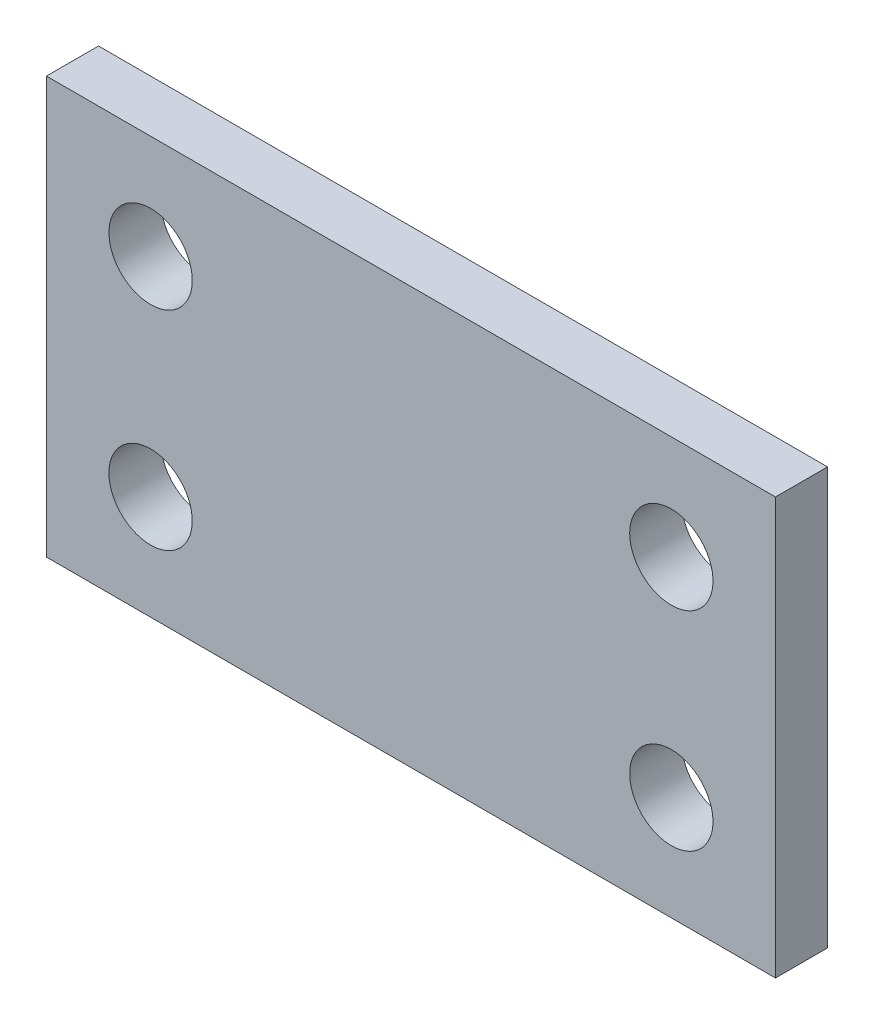
ISO-10303-21;
HEADER;
FILE_DESCRIPTION(('STEP AP214'),'2;1');
FILE_NAME('part.step','',(''),(''),'','','');
FILE_SCHEMA(('AUTOMOTIVE_DESIGN { 1 0 10303 214 1 1 1 1 }'));
ENDSEC;
DATA;
#1=APPLICATION_CONTEXT('core data for automotive mechanical design processes');
#2=APPLICATION_PROTOCOL_DEFINITION('international standard','automotive_design',2000,#1);
#3=PRODUCT_CONTEXT('',#1,'mechanical');
#4=PRODUCT('Part','Part','',(#3));
#5=PRODUCT_RELATED_PRODUCT_CATEGORY('part','',(#4));
#6=PRODUCT_DEFINITION_FORMATION('','',#4);
#7=PRODUCT_DEFINITION_CONTEXT('part definition',#1,'design');
#8=PRODUCT_DEFINITION('design','',#6,#7);
#9=PRODUCT_DEFINITION_SHAPE('','',#8);
#10=(LENGTH_UNIT() NAMED_UNIT(*) SI_UNIT(.MILLI.,.METRE.));
#11=(NAMED_UNIT(*) PLANE_ANGLE_UNIT() SI_UNIT($,.RADIAN.));
#12=(NAMED_UNIT(*) SI_UNIT($,.STERADIAN.) SOLID_ANGLE_UNIT());
#13=UNCERTAINTY_MEASURE_WITH_UNIT(LENGTH_MEASURE(1.E-05),#10,'distance_accuracy_value','');
#14=(GEOMETRIC_REPRESENTATION_CONTEXT(3) GLOBAL_UNCERTAINTY_ASSIGNED_CONTEXT((#13)) GLOBAL_UNIT_ASSIGNED_CONTEXT((#10,
#11,#12)) REPRESENTATION_CONTEXT('',''));
#15=CARTESIAN_POINT('',(0.,0.,0.));
#16=DIRECTION('',(0.,0.,1.));
#17=DIRECTION('',(1.,0.,0.));
#18=AXIS2_PLACEMENT_3D('',#15,#16,#17);
#19=CARTESIAN_POINT('',(0.,0.,10.));
#20=DIRECTION('',(0.,0.,1.));
#21=DIRECTION('',(1.,0.,0.));
#22=AXIS2_PLACEMENT_3D('',#19,#20,#21);
#23=PLANE('',#22);
#24=CARTESIAN_POINT('',(50.,-20.,10.));
#25=DIRECTION('',(0.,0.,1.));
#26=DIRECTION('',(1.,0.,0.));
#27=AXIS2_PLACEMENT_3D('',#24,#25,#26);
#28=CIRCLE('',#27,8.00000000000001);
#29=CARTESIAN_POINT('',(58.,-20.,10.));
#30=VERTEX_POINT('',#29);
#31=EDGE_CURVE('E122',#30,#30,#28,.T.);
#32=ORIENTED_EDGE('',*,*,#31,.F.);
#33=EDGE_LOOP('',(#32));
#34=FACE_BOUND('',#33,.T.);
#35=CARTESIAN_POINT('',(-50.,20.,10.));
#36=DIRECTION('',(0.,0.,1.));
#37=DIRECTION('',(1.,0.,0.));
#38=AXIS2_PLACEMENT_3D('',#35,#36,#37);
#39=CIRCLE('',#38,8.00000000000001);
#40=CARTESIAN_POINT('',(-42.,20.,10.));
#41=VERTEX_POINT('',#40);
#42=EDGE_CURVE('E101',#41,#41,#39,.T.);
#43=ORIENTED_EDGE('',*,*,#42,.F.);
#44=EDGE_LOOP('',(#43));
#45=FACE_BOUND('',#44,.T.);
#46=DIRECTION('',(0.,1.,0.));
#47=VECTOR('',#46,1.);
#48=CARTESIAN_POINT('',(70.,40.,10.));
#49=LINE('',#48,#47);
#50=CARTESIAN_POINT('',(70.,-40.,10.));
#51=VERTEX_POINT('',#50);
#52=CARTESIAN_POINT('',(70.,40.,10.));
#53=VERTEX_POINT('',#52);
#54=EDGE_CURVE('E86',#51,#53,#49,.T.);
#55=ORIENTED_EDGE('',*,*,#54,.T.);
#56=DIRECTION('',(-1.,0.,0.));
#57=VECTOR('',#56,1.);
#58=CARTESIAN_POINT('',(-70.,40.,10.));
#59=LINE('',#58,#57);
#60=CARTESIAN_POINT('',(-70.,40.,10.));
#61=VERTEX_POINT('',#60);
#62=EDGE_CURVE('E81',#53,#61,#59,.T.);
#63=ORIENTED_EDGE('',*,*,#62,.T.);
#64=DIRECTION('',(0.,-1.,0.));
#65=VECTOR('',#64,1.);
#66=CARTESIAN_POINT('',(-70.,40.,10.));
#67=LINE('',#66,#65);
#68=CARTESIAN_POINT('',(-70.,-40.,10.));
#69=VERTEX_POINT('',#68);
#70=EDGE_CURVE('E84',#61,#69,#67,.T.);
#71=ORIENTED_EDGE('',*,*,#70,.T.);
#72=DIRECTION('',(1.,0.,0.));
#73=VECTOR('',#72,1.);
#74=CARTESIAN_POINT('',(-70.,-40.,10.));
#75=LINE('',#74,#73);
#76=EDGE_CURVE('E51',#69,#51,#75,.T.);
#77=ORIENTED_EDGE('',*,*,#76,.T.);
#78=EDGE_LOOP('',(#55,#63,#71,#77));
#79=FACE_BOUND('',#78,.T.);
#80=CARTESIAN_POINT('',(50.,20.,10.));
#81=DIRECTION('',(0.,0.,1.));
#82=DIRECTION('',(-1.,0.,0.));
#83=AXIS2_PLACEMENT_3D('',#80,#81,#82);
#84=CIRCLE('',#83,8.00000000000001);
#85=CARTESIAN_POINT('',(42.,20.,10.));
#86=VERTEX_POINT('',#85);
#87=EDGE_CURVE('E116',#86,#86,#84,.T.);
#88=ORIENTED_EDGE('',*,*,#87,.F.);
#89=EDGE_LOOP('',(#88));
#90=FACE_BOUND('',#89,.T.);
#91=CARTESIAN_POINT('',(-50.,-20.,10.));
#92=DIRECTION('',(0.,0.,1.));
#93=DIRECTION('',(-1.,0.,0.));
#94=AXIS2_PLACEMENT_3D('',#91,#92,#93);
#95=CIRCLE('',#94,8.00000000000001);
#96=CARTESIAN_POINT('',(-58.,-20.,10.));
#97=VERTEX_POINT('',#96);
#98=EDGE_CURVE('E128',#97,#97,#95,.T.);
#99=ORIENTED_EDGE('',*,*,#98,.F.);
#100=EDGE_LOOP('',(#99));
#101=FACE_BOUND('',#100,.T.);
#102=ADVANCED_FACE('F34',(#34,#45,#79,#90,#101),#23,.T.);
#103=CARTESIAN_POINT('',(0.,0.,0.));
#104=DIRECTION('',(0.,0.,1.));
#105=DIRECTION('',(1.,0.,0.));
#106=AXIS2_PLACEMENT_3D('',#103,#104,#105);
#107=PLANE('',#106);
#108=DIRECTION('',(0.,1.,0.));
#109=VECTOR('',#108,1.);
#110=CARTESIAN_POINT('',(70.,40.,0.));
#111=LINE('',#110,#109);
#112=CARTESIAN_POINT('',(70.,-40.,0.));
#113=VERTEX_POINT('',#112);
#114=CARTESIAN_POINT('',(70.,40.,0.));
#115=VERTEX_POINT('',#114);
#116=EDGE_CURVE('E98',#113,#115,#111,.T.);
#117=ORIENTED_EDGE('',*,*,#116,.F.);
#118=DIRECTION('',(1.,0.,0.));
#119=VECTOR('',#118,1.);
#120=CARTESIAN_POINT('',(-70.,-40.,0.));
#121=LINE('',#120,#119);
#122=CARTESIAN_POINT('',(-70.,-40.,0.));
#123=VERTEX_POINT('',#122);
#124=EDGE_CURVE('E74',#123,#113,#121,.T.);
#125=ORIENTED_EDGE('',*,*,#124,.F.);
#126=DIRECTION('',(0.,-1.,0.));
#127=VECTOR('',#126,1.);
#128=CARTESIAN_POINT('',(-70.,40.,0.));
#129=LINE('',#128,#127);
#130=CARTESIAN_POINT('',(-70.,40.,0.));
#131=VERTEX_POINT('',#130);
#132=EDGE_CURVE('E68',#131,#123,#129,.T.);
#133=ORIENTED_EDGE('',*,*,#132,.F.);
#134=DIRECTION('',(-1.,0.,0.));
#135=VECTOR('',#134,1.);
#136=CARTESIAN_POINT('',(-70.,40.,0.));
#137=LINE('',#136,#135);
#138=EDGE_CURVE('E90',#115,#131,#137,.T.);
#139=ORIENTED_EDGE('',*,*,#138,.F.);
#140=EDGE_LOOP('',(#117,#125,#133,#139));
#141=FACE_BOUND('',#140,.T.);
#142=CARTESIAN_POINT('',(-50.,20.,0.));
#143=DIRECTION('',(0.,0.,1.));
#144=DIRECTION('',(1.,0.,0.));
#145=AXIS2_PLACEMENT_3D('',#142,#143,#144);
#146=CIRCLE('',#145,8.00000000000001);
#147=CARTESIAN_POINT('',(-42.,20.,0.));
#148=VERTEX_POINT('',#147);
#149=EDGE_CURVE('E113',#148,#148,#146,.T.);
#150=ORIENTED_EDGE('',*,*,#149,.T.);
#151=EDGE_LOOP('',(#150));
#152=FACE_BOUND('',#151,.T.);
#153=CARTESIAN_POINT('',(50.,20.,0.));
#154=DIRECTION('',(0.,0.,1.));
#155=DIRECTION('',(-1.,0.,0.));
#156=AXIS2_PLACEMENT_3D('',#153,#154,#155);
#157=CIRCLE('',#156,8.00000000000001);
#158=CARTESIAN_POINT('',(42.,20.,0.));
#159=VERTEX_POINT('',#158);
#160=EDGE_CURVE('E119',#159,#159,#157,.T.);
#161=ORIENTED_EDGE('',*,*,#160,.T.);
#162=EDGE_LOOP('',(#161));
#163=FACE_BOUND('',#162,.T.);
#164=CARTESIAN_POINT('',(50.,-20.,0.));
#165=DIRECTION('',(0.,0.,1.));
#166=DIRECTION('',(1.,0.,0.));
#167=AXIS2_PLACEMENT_3D('',#164,#165,#166);
#168=CIRCLE('',#167,8.00000000000001);
#169=CARTESIAN_POINT('',(58.,-20.,0.));
#170=VERTEX_POINT('',#169);
#171=EDGE_CURVE('E125',#170,#170,#168,.T.);
#172=ORIENTED_EDGE('',*,*,#171,.T.);
#173=EDGE_LOOP('',(#172));
#174=FACE_BOUND('',#173,.T.);
#175=CARTESIAN_POINT('',(-50.,-20.,0.));
#176=DIRECTION('',(0.,0.,1.));
#177=DIRECTION('',(-1.,0.,0.));
#178=AXIS2_PLACEMENT_3D('',#175,#176,#177);
#179=CIRCLE('',#178,8.00000000000001);
#180=CARTESIAN_POINT('',(-58.,-20.,0.));
#181=VERTEX_POINT('',#180);
#182=EDGE_CURVE('E131',#181,#181,#179,.T.);
#183=ORIENTED_EDGE('',*,*,#182,.T.);
#184=EDGE_LOOP('',(#183));
#185=FACE_BOUND('',#184,.T.);
#186=ADVANCED_FACE('F109',(#141,#152,#163,#174,#185),#107,.F.);
#187=CARTESIAN_POINT('',(70.,40.,10.));
#188=DIRECTION('',(-1.,0.,0.));
#189=DIRECTION('',(0.,0.,1.));
#190=AXIS2_PLACEMENT_3D('',#187,#188,#189);
#191=PLANE('',#190);
#192=ORIENTED_EDGE('',*,*,#116,.T.);
#193=DIRECTION('',(0.,0.,-1.));
#194=VECTOR('',#193,1.);
#195=CARTESIAN_POINT('',(70.,40.,10.));
#196=LINE('',#195,#194);
#197=EDGE_CURVE('E11',#53,#115,#196,.T.);
#198=ORIENTED_EDGE('',*,*,#197,.F.);
#199=ORIENTED_EDGE('',*,*,#54,.F.);
#200=DIRECTION('',(0.,0.,-1.));
#201=VECTOR('',#200,1.);
#202=CARTESIAN_POINT('',(70.,-40.,10.));
#203=LINE('',#202,#201);
#204=EDGE_CURVE('E94',#51,#113,#203,.T.);
#205=ORIENTED_EDGE('',*,*,#204,.T.);
#206=EDGE_LOOP('',(#192,#198,#199,#205));
#207=FACE_BOUND('',#206,.T.);
#208=ADVANCED_FACE('F36',(#207),#191,.F.);
#209=CARTESIAN_POINT('',(-70.,40.,10.));
#210=DIRECTION('',(0.,-1.,0.));
#211=DIRECTION('',(1.,0.,0.));
#212=AXIS2_PLACEMENT_3D('',#209,#210,#211);
#213=PLANE('',#212);
#214=ORIENTED_EDGE('',*,*,#138,.T.);
#215=DIRECTION('',(0.,0.,-1.));
#216=VECTOR('',#215,1.);
#217=CARTESIAN_POINT('',(-70.,40.,10.));
#218=LINE('',#217,#216);
#219=EDGE_CURVE('E43',#61,#131,#218,.T.);
#220=ORIENTED_EDGE('',*,*,#219,.F.);
#221=ORIENTED_EDGE('',*,*,#62,.F.);
#222=ORIENTED_EDGE('',*,*,#197,.T.);
#223=EDGE_LOOP('',(#214,#220,#221,#222));
#224=FACE_BOUND('',#223,.T.);
#225=ADVANCED_FACE('F89',(#224),#213,.F.);
#226=CARTESIAN_POINT('',(-70.,40.,10.));
#227=DIRECTION('',(1.,0.,0.));
#228=DIRECTION('',(0.,0.,-1.));
#229=AXIS2_PLACEMENT_3D('',#226,#227,#228);
#230=PLANE('',#229);
#231=ORIENTED_EDGE('',*,*,#132,.T.);
#232=DIRECTION('',(0.,0.,-1.));
#233=VECTOR('',#232,1.);
#234=CARTESIAN_POINT('',(-70.,-40.,10.));
#235=LINE('',#234,#233);
#236=EDGE_CURVE('E91',#69,#123,#235,.T.);
#237=ORIENTED_EDGE('',*,*,#236,.F.);
#238=ORIENTED_EDGE('',*,*,#70,.F.);
#239=ORIENTED_EDGE('',*,*,#219,.T.);
#240=EDGE_LOOP('',(#231,#237,#238,#239));
#241=FACE_BOUND('',#240,.T.);
#242=ADVANCED_FACE('F92',(#241),#230,.F.);
#243=CARTESIAN_POINT('',(-70.,-40.,10.));
#244=DIRECTION('',(0.,1.,0.));
#245=DIRECTION('',(0.,0.,1.));
#246=AXIS2_PLACEMENT_3D('',#243,#244,#245);
#247=PLANE('',#246);
#248=ORIENTED_EDGE('',*,*,#124,.T.);
#249=ORIENTED_EDGE('',*,*,#204,.F.);
#250=ORIENTED_EDGE('',*,*,#76,.F.);
#251=ORIENTED_EDGE('',*,*,#236,.T.);
#252=EDGE_LOOP('',(#248,#249,#250,#251));
#253=FACE_BOUND('',#252,.T.);
#254=ADVANCED_FACE('F106',(#253),#247,.F.);
#255=CARTESIAN_POINT('',(-50.,20.,10.));
#256=DIRECTION('',(0.,0.,-1.));
#257=DIRECTION('',(-1.,0.,0.));
#258=AXIS2_PLACEMENT_3D('',#255,#256,#257);
#259=CYLINDRICAL_SURFACE('',#258,8.00000000000001);
#260=ORIENTED_EDGE('',*,*,#42,.T.);
#261=EDGE_LOOP('',(#260));
#262=FACE_BOUND('',#261,.T.);
#263=ORIENTED_EDGE('',*,*,#149,.F.);
#264=EDGE_LOOP('',(#263));
#265=FACE_BOUND('',#264,.T.);
#266=ADVANCED_FACE('F150',(#262,#265),#259,.F.);
#267=CARTESIAN_POINT('',(50.,20.,10.));
#268=DIRECTION('',(0.,0.,-1.));
#269=DIRECTION('',(-1.,0.,0.));
#270=AXIS2_PLACEMENT_3D('',#267,#268,#269);
#271=CYLINDRICAL_SURFACE('',#270,8.00000000000001);
#272=ORIENTED_EDGE('',*,*,#87,.T.);
#273=EDGE_LOOP('',(#272));
#274=FACE_BOUND('',#273,.T.);
#275=ORIENTED_EDGE('',*,*,#160,.F.);
#276=EDGE_LOOP('',(#275));
#277=FACE_BOUND('',#276,.T.);
#278=ADVANCED_FACE('F196',(#274,#277),#271,.F.);
#279=CARTESIAN_POINT('',(50.,-20.,10.));
#280=DIRECTION('',(0.,0.,-1.));
#281=DIRECTION('',(-1.,0.,0.));
#282=AXIS2_PLACEMENT_3D('',#279,#280,#281);
#283=CYLINDRICAL_SURFACE('',#282,8.00000000000001);
#284=ORIENTED_EDGE('',*,*,#31,.T.);
#285=EDGE_LOOP('',(#284));
#286=FACE_BOUND('',#285,.T.);
#287=ORIENTED_EDGE('',*,*,#171,.F.);
#288=EDGE_LOOP('',(#287));
#289=FACE_BOUND('',#288,.T.);
#290=ADVANCED_FACE('F204',(#286,#289),#283,.F.);
#291=CARTESIAN_POINT('',(-50.,-20.,10.));
#292=DIRECTION('',(0.,0.,-1.));
#293=DIRECTION('',(-1.,0.,0.));
#294=AXIS2_PLACEMENT_3D('',#291,#292,#293);
#295=CYLINDRICAL_SURFACE('',#294,8.00000000000001);
#296=ORIENTED_EDGE('',*,*,#98,.T.);
#297=EDGE_LOOP('',(#296));
#298=FACE_BOUND('',#297,.T.);
#299=ORIENTED_EDGE('',*,*,#182,.F.);
#300=EDGE_LOOP('',(#299));
#301=FACE_BOUND('',#300,.T.);
#302=ADVANCED_FACE('F137',(#298,#301),#295,.F.);
#303=CLOSED_SHELL('',(#102,#186,#208,#225,#242,#254,#266,#278,#290,#302));
#304=MANIFOLD_SOLID_BREP('B2',#303);
#305=ADVANCED_BREP_SHAPE_REPRESENTATION('',(#18,#304),#14);
#306=SHAPE_DEFINITION_REPRESENTATION(#9,#305);
ENDSEC;
END-ISO-10303-21;
